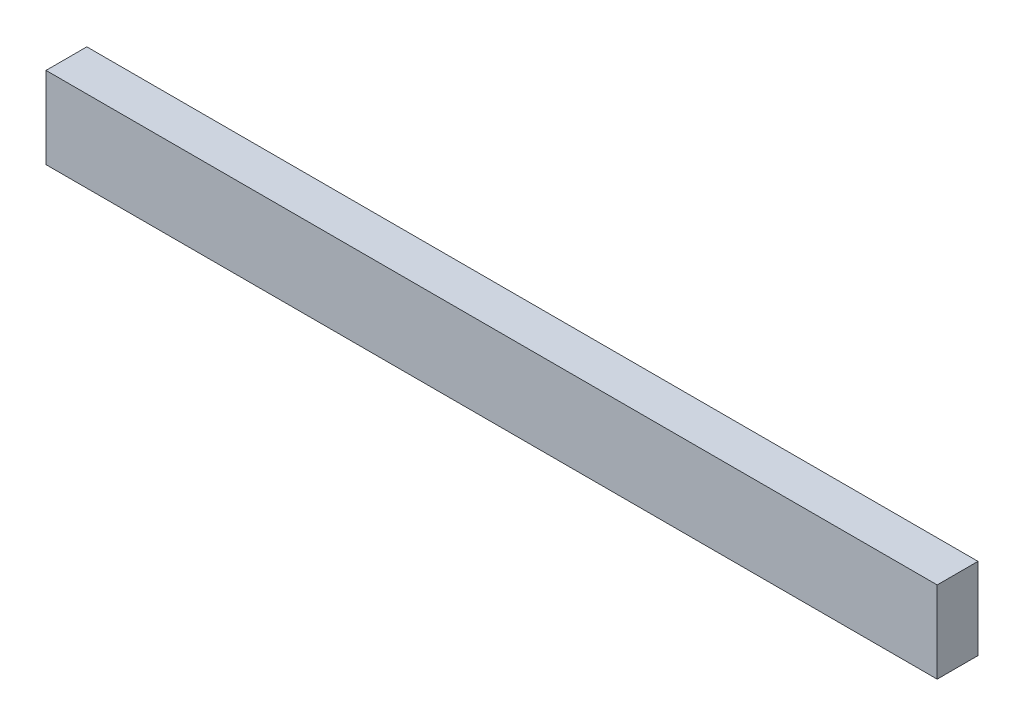
ISO-10303-21;
HEADER;
FILE_DESCRIPTION(('STEP AP214'),'2;1');
FILE_NAME('part.step','',(''),(''),'','','');
FILE_SCHEMA(('AUTOMOTIVE_DESIGN { 1 0 10303 214 1 1 1 1 }'));
ENDSEC;
DATA;
#1=APPLICATION_CONTEXT('core data for automotive mechanical design processes');
#2=APPLICATION_PROTOCOL_DEFINITION('international standard','automotive_design',2000,#1);
#3=PRODUCT_CONTEXT('',#1,'mechanical');
#4=PRODUCT('Part','Part','',(#3));
#5=PRODUCT_RELATED_PRODUCT_CATEGORY('part','',(#4));
#6=PRODUCT_DEFINITION_FORMATION('','',#4);
#7=PRODUCT_DEFINITION_CONTEXT('part definition',#1,'design');
#8=PRODUCT_DEFINITION('design','',#6,#7);
#9=PRODUCT_DEFINITION_SHAPE('','',#8);
#10=(LENGTH_UNIT() NAMED_UNIT(*) SI_UNIT(.MILLI.,.METRE.));
#11=(NAMED_UNIT(*) PLANE_ANGLE_UNIT() SI_UNIT($,.RADIAN.));
#12=(NAMED_UNIT(*) SI_UNIT($,.STERADIAN.) SOLID_ANGLE_UNIT());
#13=UNCERTAINTY_MEASURE_WITH_UNIT(LENGTH_MEASURE(1.E-05),#10,'distance_accuracy_value','');
#14=(GEOMETRIC_REPRESENTATION_CONTEXT(3) GLOBAL_UNCERTAINTY_ASSIGNED_CONTEXT((#13)) GLOBAL_UNIT_ASSIGNED_CONTEXT((#10,
#11,#12)) REPRESENTATION_CONTEXT('',''));
#15=CARTESIAN_POINT('',(0.,0.,0.));
#16=DIRECTION('',(0.,0.,1.));
#17=DIRECTION('',(1.,0.,0.));
#18=AXIS2_PLACEMENT_3D('',#15,#16,#17);
#19=CARTESIAN_POINT('',(262.,-24.,12.));
#20=DIRECTION('',(-1.,0.,0.));
#21=DIRECTION('',(0.,0.,1.));
#22=AXIS2_PLACEMENT_3D('',#19,#20,#21);
#23=PLANE('',#22);
#24=DIRECTION('',(0.,1.,0.));
#25=VECTOR('',#24,1.);
#26=CARTESIAN_POINT('',(262.,-24.,-12.));
#27=LINE('',#26,#25);
#28=CARTESIAN_POINT('',(262.,-24.,-12.));
#29=VERTEX_POINT('',#28);
#30=CARTESIAN_POINT('',(262.,24.,-12.));
#31=VERTEX_POINT('',#30);
#32=EDGE_CURVE('E106',#29,#31,#27,.T.);
#33=ORIENTED_EDGE('',*,*,#32,.T.);
#34=DIRECTION('',(0.,0.,-1.));
#35=VECTOR('',#34,1.);
#36=CARTESIAN_POINT('',(262.,24.,12.));
#37=LINE('',#36,#35);
#38=CARTESIAN_POINT('',(262.,24.,12.));
#39=VERTEX_POINT('',#38);
#40=EDGE_CURVE('E11',#39,#31,#37,.T.);
#41=ORIENTED_EDGE('',*,*,#40,.F.);
#42=DIRECTION('',(0.,1.,0.));
#43=VECTOR('',#42,1.);
#44=CARTESIAN_POINT('',(262.,-24.,12.));
#45=LINE('',#44,#43);
#46=CARTESIAN_POINT('',(262.,-24.,12.));
#47=VERTEX_POINT('',#46);
#48=EDGE_CURVE('E94',#47,#39,#45,.T.);
#49=ORIENTED_EDGE('',*,*,#48,.F.);
#50=DIRECTION('',(0.,0.,-1.));
#51=VECTOR('',#50,1.);
#52=CARTESIAN_POINT('',(262.,-24.,12.));
#53=LINE('',#52,#51);
#54=EDGE_CURVE('E102',#47,#29,#53,.T.);
#55=ORIENTED_EDGE('',*,*,#54,.T.);
#56=EDGE_LOOP('',(#33,#41,#49,#55));
#57=FACE_BOUND('',#56,.T.);
#58=ADVANCED_FACE('F43',(#57),#23,.F.);
#59=CARTESIAN_POINT('',(-262.,24.,12.));
#60=DIRECTION('',(0.,-1.,0.));
#61=DIRECTION('',(0.,0.,-1.));
#62=AXIS2_PLACEMENT_3D('',#59,#60,#61);
#63=PLANE('',#62);
#64=DIRECTION('',(-1.,0.,0.));
#65=VECTOR('',#64,1.);
#66=CARTESIAN_POINT('',(-262.,24.,-12.));
#67=LINE('',#66,#65);
#68=CARTESIAN_POINT('',(-262.,24.,-12.));
#69=VERTEX_POINT('',#68);
#70=EDGE_CURVE('E98',#31,#69,#67,.T.);
#71=ORIENTED_EDGE('',*,*,#70,.T.);
#72=DIRECTION('',(0.,0.,-1.));
#73=VECTOR('',#72,1.);
#74=CARTESIAN_POINT('',(-262.,24.,12.));
#75=LINE('',#74,#73);
#76=CARTESIAN_POINT('',(-262.,24.,12.));
#77=VERTEX_POINT('',#76);
#78=EDGE_CURVE('E51',#77,#69,#75,.T.);
#79=ORIENTED_EDGE('',*,*,#78,.F.);
#80=DIRECTION('',(-1.,0.,0.));
#81=VECTOR('',#80,1.);
#82=CARTESIAN_POINT('',(-262.,24.,12.));
#83=LINE('',#82,#81);
#84=EDGE_CURVE('E89',#39,#77,#83,.T.);
#85=ORIENTED_EDGE('',*,*,#84,.F.);
#86=ORIENTED_EDGE('',*,*,#40,.T.);
#87=EDGE_LOOP('',(#71,#79,#85,#86));
#88=FACE_BOUND('',#87,.T.);
#89=ADVANCED_FACE('F97',(#88),#63,.F.);
#90=CARTESIAN_POINT('',(-262.,-24.,12.));
#91=DIRECTION('',(1.,0.,0.));
#92=DIRECTION('',(0.,0.,-1.));
#93=AXIS2_PLACEMENT_3D('',#90,#91,#92);
#94=PLANE('',#93);
#95=DIRECTION('',(0.,-1.,0.));
#96=VECTOR('',#95,1.);
#97=CARTESIAN_POINT('',(-262.,-24.,-12.));
#98=LINE('',#97,#96);
#99=CARTESIAN_POINT('',(-262.,-24.,-12.));
#100=VERTEX_POINT('',#99);
#101=EDGE_CURVE('E76',#69,#100,#98,.T.);
#102=ORIENTED_EDGE('',*,*,#101,.T.);
#103=DIRECTION('',(0.,0.,-1.));
#104=VECTOR('',#103,1.);
#105=CARTESIAN_POINT('',(-262.,-24.,12.));
#106=LINE('',#105,#104);
#107=CARTESIAN_POINT('',(-262.,-24.,12.));
#108=VERTEX_POINT('',#107);
#109=EDGE_CURVE('E99',#108,#100,#106,.T.);
#110=ORIENTED_EDGE('',*,*,#109,.F.);
#111=DIRECTION('',(0.,-1.,0.));
#112=VECTOR('',#111,1.);
#113=CARTESIAN_POINT('',(-262.,-24.,12.));
#114=LINE('',#113,#112);
#115=EDGE_CURVE('E92',#77,#108,#114,.T.);
#116=ORIENTED_EDGE('',*,*,#115,.F.);
#117=ORIENTED_EDGE('',*,*,#78,.T.);
#118=EDGE_LOOP('',(#102,#110,#116,#117));
#119=FACE_BOUND('',#118,.T.);
#120=ADVANCED_FACE('F100',(#119),#94,.F.);
#121=CARTESIAN_POINT('',(-262.,-24.,12.));
#122=DIRECTION('',(0.,1.,0.));
#123=DIRECTION('',(0.,0.,1.));
#124=AXIS2_PLACEMENT_3D('',#121,#122,#123);
#125=PLANE('',#124);
#126=DIRECTION('',(1.,0.,0.));
#127=VECTOR('',#126,1.);
#128=CARTESIAN_POINT('',(-262.,-24.,-12.));
#129=LINE('',#128,#127);
#130=EDGE_CURVE('E82',#100,#29,#129,.T.);
#131=ORIENTED_EDGE('',*,*,#130,.T.);
#132=ORIENTED_EDGE('',*,*,#54,.F.);
#133=DIRECTION('',(1.,0.,0.));
#134=VECTOR('',#133,1.);
#135=CARTESIAN_POINT('',(-262.,-24.,12.));
#136=LINE('',#135,#134);
#137=EDGE_CURVE('E59',#108,#47,#136,.T.);
#138=ORIENTED_EDGE('',*,*,#137,.F.);
#139=ORIENTED_EDGE('',*,*,#109,.T.);
#140=EDGE_LOOP('',(#131,#132,#138,#139));
#141=FACE_BOUND('',#140,.T.);
#142=ADVANCED_FACE('F113',(#141),#125,.F.);
#143=CARTESIAN_POINT('',(0.,0.,12.));
#144=DIRECTION('',(0.,0.,-1.));
#145=DIRECTION('',(-1.,0.,0.));
#146=AXIS2_PLACEMENT_3D('',#143,#144,#145);
#147=PLANE('',#146);
#148=ORIENTED_EDGE('',*,*,#48,.T.);
#149=ORIENTED_EDGE('',*,*,#84,.T.);
#150=ORIENTED_EDGE('',*,*,#115,.T.);
#151=ORIENTED_EDGE('',*,*,#137,.T.);
#152=EDGE_LOOP('',(#148,#149,#150,#151));
#153=FACE_BOUND('',#152,.T.);
#154=ADVANCED_FACE('F90',(#153),#147,.F.);
#155=CARTESIAN_POINT('',(0.,0.,-12.));
#156=DIRECTION('',(0.,0.,-1.));
#157=DIRECTION('',(-1.,0.,0.));
#158=AXIS2_PLACEMENT_3D('',#155,#156,#157);
#159=PLANE('',#158);
#160=ORIENTED_EDGE('',*,*,#32,.F.);
#161=ORIENTED_EDGE('',*,*,#130,.F.);
#162=ORIENTED_EDGE('',*,*,#101,.F.);
#163=ORIENTED_EDGE('',*,*,#70,.F.);
#164=EDGE_LOOP('',(#160,#161,#162,#163));
#165=FACE_BOUND('',#164,.T.);
#166=ADVANCED_FACE('F116',(#165),#159,.T.);
#167=CLOSED_SHELL('',(#58,#89,#120,#142,#154,#166));
#168=MANIFOLD_SOLID_BREP('B2',#167);
#169=ADVANCED_BREP_SHAPE_REPRESENTATION('',(#18,#168),#14);
#170=SHAPE_DEFINITION_REPRESENTATION(#9,#169);
ENDSEC;
END-ISO-10303-21;
